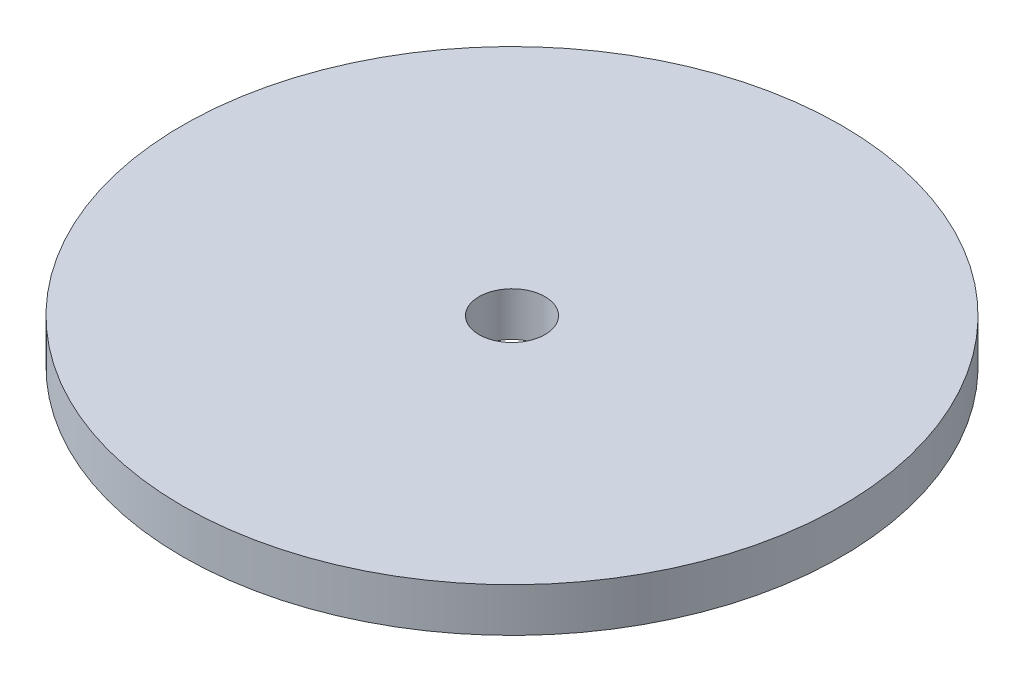
ISO-10303-21;
HEADER;
FILE_DESCRIPTION(('STEP AP214'),'2;1');
FILE_NAME('part.step','',(''),(''),'','','');
FILE_SCHEMA(('AUTOMOTIVE_DESIGN { 1 0 10303 214 1 1 1 1 }'));
ENDSEC;
DATA;
#1=APPLICATION_CONTEXT('core data for automotive mechanical design processes');
#2=APPLICATION_PROTOCOL_DEFINITION('international standard','automotive_design',2000,#1);
#3=PRODUCT_CONTEXT('',#1,'mechanical');
#4=PRODUCT('Part','Part','',(#3));
#5=PRODUCT_RELATED_PRODUCT_CATEGORY('part','',(#4));
#6=PRODUCT_DEFINITION_FORMATION('','',#4);
#7=PRODUCT_DEFINITION_CONTEXT('part definition',#1,'design');
#8=PRODUCT_DEFINITION('design','',#6,#7);
#9=PRODUCT_DEFINITION_SHAPE('','',#8);
#10=(LENGTH_UNIT() NAMED_UNIT(*) SI_UNIT(.MILLI.,.METRE.));
#11=(NAMED_UNIT(*) PLANE_ANGLE_UNIT() SI_UNIT($,.RADIAN.));
#12=(NAMED_UNIT(*) SI_UNIT($,.STERADIAN.) SOLID_ANGLE_UNIT());
#13=UNCERTAINTY_MEASURE_WITH_UNIT(LENGTH_MEASURE(1.E-05),#10,'distance_accuracy_value','');
#14=(GEOMETRIC_REPRESENTATION_CONTEXT(3) GLOBAL_UNCERTAINTY_ASSIGNED_CONTEXT((#13)) GLOBAL_UNIT_ASSIGNED_CONTEXT((#10,
#11,#12)) REPRESENTATION_CONTEXT('',''));
#15=CARTESIAN_POINT('',(0.,0.,0.));
#16=DIRECTION('',(0.,0.,1.));
#17=DIRECTION('',(1.,0.,0.));
#18=AXIS2_PLACEMENT_3D('',#15,#16,#17);
#19=CARTESIAN_POINT('',(0.,10.,0.));
#20=DIRECTION('',(0.,1.,0.));
#21=DIRECTION('',(0.,0.,1.));
#22=AXIS2_PLACEMENT_3D('',#19,#20,#21);
#23=PLANE('',#22);
#24=CARTESIAN_POINT('',(0.,10.,0.));
#25=DIRECTION('',(0.,1.,0.));
#26=DIRECTION('',(0.,0.,1.));
#27=AXIS2_PLACEMENT_3D('',#24,#25,#26);
#28=CIRCLE('',#27,75.);
#29=CARTESIAN_POINT('',(0.,10.,75.));
#30=VERTEX_POINT('',#29);
#31=EDGE_CURVE('E10',#30,#30,#28,.T.);
#32=ORIENTED_EDGE('',*,*,#31,.T.);
#33=EDGE_LOOP('',(#32));
#34=FACE_BOUND('',#33,.T.);
#35=CARTESIAN_POINT('',(0.,10.,0.));
#36=DIRECTION('',(0.,1.,0.));
#37=DIRECTION('',(0.,0.,1.));
#38=AXIS2_PLACEMENT_3D('',#35,#36,#37);
#39=CIRCLE('',#38,7.5);
#40=CARTESIAN_POINT('',(0.,10.,7.5));
#41=VERTEX_POINT('',#40);
#42=EDGE_CURVE('E47',#41,#41,#39,.T.);
#43=ORIENTED_EDGE('',*,*,#42,.F.);
#44=EDGE_LOOP('',(#43));
#45=FACE_BOUND('',#44,.T.);
#46=ADVANCED_FACE('F32',(#34,#45),#23,.T.);
#47=CARTESIAN_POINT('',(0.,0.,0.));
#48=DIRECTION('',(0.,1.,0.));
#49=DIRECTION('',(0.,0.,1.));
#50=AXIS2_PLACEMENT_3D('',#47,#48,#49);
#51=PLANE('',#50);
#52=CARTESIAN_POINT('',(0.,0.,0.));
#53=DIRECTION('',(0.,1.,0.));
#54=DIRECTION('',(0.,0.,1.));
#55=AXIS2_PLACEMENT_3D('',#52,#53,#54);
#56=CIRCLE('',#55,75.);
#57=CARTESIAN_POINT('',(0.,0.,75.));
#58=VERTEX_POINT('',#57);
#59=EDGE_CURVE('E36',#58,#58,#56,.T.);
#60=ORIENTED_EDGE('',*,*,#59,.F.);
#61=EDGE_LOOP('',(#60));
#62=FACE_BOUND('',#61,.T.);
#63=CARTESIAN_POINT('',(0.,0.,0.));
#64=DIRECTION('',(0.,1.,0.));
#65=DIRECTION('',(0.,0.,1.));
#66=AXIS2_PLACEMENT_3D('',#63,#64,#65);
#67=CIRCLE('',#66,7.5);
#68=CARTESIAN_POINT('',(0.,0.,7.5));
#69=VERTEX_POINT('',#68);
#70=EDGE_CURVE('E49',#69,#69,#67,.T.);
#71=ORIENTED_EDGE('',*,*,#70,.T.);
#72=EDGE_LOOP('',(#71));
#73=FACE_BOUND('',#72,.T.);
#74=ADVANCED_FACE('F59',(#62,#73),#51,.F.);
#75=CARTESIAN_POINT('',(0.,10.,0.));
#76=DIRECTION('',(0.,-1.,0.));
#77=DIRECTION('',(0.,0.,-1.));
#78=AXIS2_PLACEMENT_3D('',#75,#76,#77);
#79=CYLINDRICAL_SURFACE('',#78,75.);
#80=ORIENTED_EDGE('',*,*,#31,.F.);
#81=EDGE_LOOP('',(#80));
#82=FACE_BOUND('',#81,.T.);
#83=ORIENTED_EDGE('',*,*,#59,.T.);
#84=EDGE_LOOP('',(#83));
#85=FACE_BOUND('',#84,.T.);
#86=ADVANCED_FACE('F34',(#82,#85),#79,.T.);
#87=CARTESIAN_POINT('',(0.,10.,0.));
#88=DIRECTION('',(0.,-1.,0.));
#89=DIRECTION('',(0.,0.,-1.));
#90=AXIS2_PLACEMENT_3D('',#87,#88,#89);
#91=CYLINDRICAL_SURFACE('',#90,7.5);
#92=ORIENTED_EDGE('',*,*,#42,.T.);
#93=EDGE_LOOP('',(#92));
#94=FACE_BOUND('',#93,.T.);
#95=ORIENTED_EDGE('',*,*,#70,.F.);
#96=EDGE_LOOP('',(#95));
#97=FACE_BOUND('',#96,.T.);
#98=ADVANCED_FACE('F55',(#94,#97),#91,.F.);
#99=CLOSED_SHELL('',(#46,#74,#86,#98));
#100=MANIFOLD_SOLID_BREP('B2',#99);
#101=ADVANCED_BREP_SHAPE_REPRESENTATION('',(#18,#100),#14);
#102=SHAPE_DEFINITION_REPRESENTATION(#9,#101);
ENDSEC;
END-ISO-10303-21;
